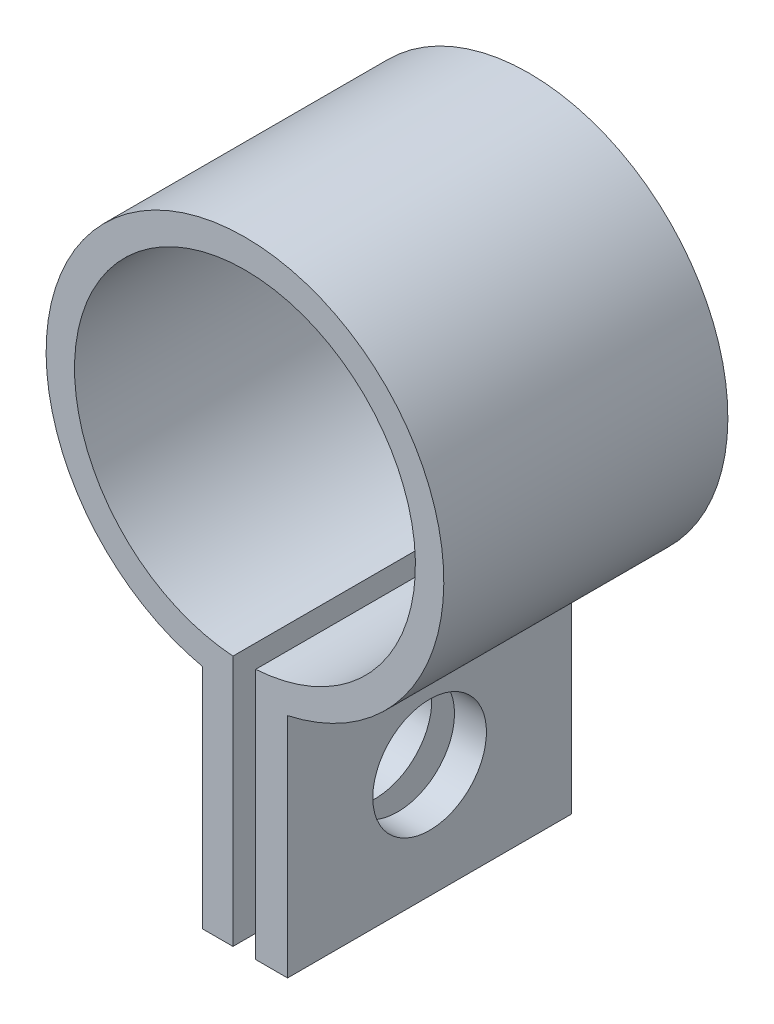
ISO-10303-21;
HEADER;
FILE_DESCRIPTION(('STEP AP214'),'2;1');
FILE_NAME('part.step','',(''),(''),'','','');
FILE_SCHEMA(('AUTOMOTIVE_DESIGN { 1 0 10303 214 1 1 1 1 }'));
ENDSEC;
DATA;
#1=APPLICATION_CONTEXT('core data for automotive mechanical design processes');
#2=APPLICATION_PROTOCOL_DEFINITION('international standard','automotive_design',2000,#1);
#3=PRODUCT_CONTEXT('',#1,'mechanical');
#4=PRODUCT('Part','Part','',(#3));
#5=PRODUCT_RELATED_PRODUCT_CATEGORY('part','',(#4));
#6=PRODUCT_DEFINITION_FORMATION('','',#4);
#7=PRODUCT_DEFINITION_CONTEXT('part definition',#1,'design');
#8=PRODUCT_DEFINITION('design','',#6,#7);
#9=PRODUCT_DEFINITION_SHAPE('','',#8);
#10=(LENGTH_UNIT() NAMED_UNIT(*) SI_UNIT(.MILLI.,.METRE.));
#11=(NAMED_UNIT(*) PLANE_ANGLE_UNIT() SI_UNIT($,.RADIAN.));
#12=(NAMED_UNIT(*) SI_UNIT($,.STERADIAN.) SOLID_ANGLE_UNIT());
#13=UNCERTAINTY_MEASURE_WITH_UNIT(LENGTH_MEASURE(1.E-05),#10,'distance_accuracy_value','');
#14=(GEOMETRIC_REPRESENTATION_CONTEXT(3) GLOBAL_UNCERTAINTY_ASSIGNED_CONTEXT((#13)) GLOBAL_UNIT_ASSIGNED_CONTEXT((#10,
#11,#12)) REPRESENTATION_CONTEXT('',''));
#15=CARTESIAN_POINT('',(0.,0.,0.));
#16=DIRECTION('',(0.,0.,1.));
#17=DIRECTION('',(1.,0.,0.));
#18=AXIS2_PLACEMENT_3D('',#15,#16,#17);
#19=CARTESIAN_POINT('',(1.5,-14.8373971655887,5.));
#20=DIRECTION('',(0.,1.,0.));
#21=DIRECTION('',(0.,0.,1.));
#22=AXIS2_PLACEMENT_3D('',#19,#20,#21);
#23=PLANE('',#22);
#24=DIRECTION('',(1.,0.,0.));
#25=VECTOR('',#24,1.);
#26=CARTESIAN_POINT('',(1.5,-14.8373971655887,-5.));
#27=LINE('',#26,#25);
#28=CARTESIAN_POINT('',(-1.5,-14.8373971655887,-5.));
#29=VERTEX_POINT('',#28);
#30=CARTESIAN_POINT('',(-0.423202653319375,-14.8373971655887,-5.));
#31=VERTEX_POINT('',#30);
#32=EDGE_CURVE('E140',#29,#31,#27,.T.);
#33=ORIENTED_EDGE('',*,*,#32,.T.);
#34=DIRECTION('',(0.,0.,1.));
#35=VECTOR('',#34,1.);
#36=CARTESIAN_POINT('',(-0.423202653319375,-14.8373971655887,5.));
#37=LINE('',#36,#35);
#38=CARTESIAN_POINT('',(-0.423202653319375,-14.8373971655887,5.));
#39=VERTEX_POINT('',#38);
#40=EDGE_CURVE('E130',#31,#39,#37,.T.);
#41=ORIENTED_EDGE('',*,*,#40,.T.);
#42=DIRECTION('',(1.,0.,0.));
#43=VECTOR('',#42,1.);
#44=CARTESIAN_POINT('',(1.5,-14.8373971655887,5.));
#45=LINE('',#44,#43);
#46=CARTESIAN_POINT('',(-1.5,-14.8373971655887,5.));
#47=VERTEX_POINT('',#46);
#48=EDGE_CURVE('E116',#47,#39,#45,.T.);
#49=ORIENTED_EDGE('',*,*,#48,.F.);
#50=DIRECTION('',(0.,0.,-1.));
#51=VECTOR('',#50,1.);
#52=CARTESIAN_POINT('',(-1.5,-14.8373971655887,5.));
#53=LINE('',#52,#51);
#54=EDGE_CURVE('E162',#47,#29,#53,.T.);
#55=ORIENTED_EDGE('',*,*,#54,.T.);
#56=EDGE_LOOP('',(#33,#41,#49,#55));
#57=FACE_BOUND('',#56,.T.);
#58=ADVANCED_FACE('F39',(#57),#23,.F.);
#59=CARTESIAN_POINT('',(0.,0.,5.));
#60=DIRECTION('',(0.,0.,1.));
#61=DIRECTION('',(1.,0.,0.));
#62=AXIS2_PLACEMENT_3D('',#59,#60,#61);
#63=PLANE('',#62);
#64=DIRECTION('',(0.,-1.,0.));
#65=VECTOR('',#64,1.);
#66=CARTESIAN_POINT('',(-0.423202653319375,0.,5.));
#67=LINE('',#66,#65);
#68=CARTESIAN_POINT('',(-0.423202653319375,-5.98505635012933,5.));
#69=VERTEX_POINT('',#68);
#70=EDGE_CURVE('E104',#69,#39,#67,.T.);
#71=ORIENTED_EDGE('',*,*,#70,.F.);
#72=CARTESIAN_POINT('',(0.,0.,5.));
#73=DIRECTION('',(0.,0.,1.));
#74=DIRECTION('',(1.,0.,0.));
#75=AXIS2_PLACEMENT_3D('',#72,#73,#74);
#76=CIRCLE('',#75,6.);
#77=CARTESIAN_POINT('',(0.376647387592764,-5.98816639259628,5.));
#78=VERTEX_POINT('',#77);
#79=EDGE_CURVE('E114',#78,#69,#76,.T.);
#80=ORIENTED_EDGE('',*,*,#79,.F.);
#81=DIRECTION('',(0.,1.,0.));
#82=VECTOR('',#81,1.);
#83=CARTESIAN_POINT('',(0.376647387592764,0.,5.));
#84=LINE('',#83,#82);
#85=CARTESIAN_POINT('',(0.376647387592764,-14.8373971655887,5.));
#86=VERTEX_POINT('',#85);
#87=EDGE_CURVE('E63',#86,#78,#84,.T.);
#88=ORIENTED_EDGE('',*,*,#87,.F.);
#89=CARTESIAN_POINT('',(1.5,-14.8373971655887,5.));
#90=VERTEX_POINT('',#89);
#91=EDGE_CURVE('E146',#86,#90,#45,.T.);
#92=ORIENTED_EDGE('',*,*,#91,.T.);
#93=DIRECTION('',(0.,1.,0.));
#94=VECTOR('',#93,1.);
#95=CARTESIAN_POINT('',(1.5,-14.8373971655887,5.));
#96=LINE('',#95,#94);
#97=CARTESIAN_POINT('',(1.5,-6.83739716558867,5.));
#98=VERTEX_POINT('',#97);
#99=EDGE_CURVE('E135',#90,#98,#96,.T.);
#100=ORIENTED_EDGE('',*,*,#99,.T.);
#101=CARTESIAN_POINT('',(0.,0.,5.));
#102=DIRECTION('',(0.,0.,1.));
#103=DIRECTION('',(1.,0.,0.));
#104=AXIS2_PLACEMENT_3D('',#101,#102,#103);
#105=CIRCLE('',#104,7.);
#106=CARTESIAN_POINT('',(-1.5,-6.83739716558867,5.));
#107=VERTEX_POINT('',#106);
#108=EDGE_CURVE('E139',#98,#107,#105,.T.);
#109=ORIENTED_EDGE('',*,*,#108,.T.);
#110=DIRECTION('',(0.,-1.,0.));
#111=VECTOR('',#110,1.);
#112=CARTESIAN_POINT('',(-1.5,-14.8373971655887,5.));
#113=LINE('',#112,#111);
#114=EDGE_CURVE('E143',#107,#47,#113,.T.);
#115=ORIENTED_EDGE('',*,*,#114,.T.);
#116=ORIENTED_EDGE('',*,*,#48,.T.);
#117=EDGE_LOOP('',(#71,#80,#88,#92,#100,#109,#115,#116));
#118=FACE_BOUND('',#117,.T.);
#119=ADVANCED_FACE('F113',(#118),#63,.T.);
#120=CARTESIAN_POINT('',(0.,0.,-5.));
#121=DIRECTION('',(0.,0.,1.));
#122=DIRECTION('',(1.,0.,0.));
#123=AXIS2_PLACEMENT_3D('',#120,#121,#122);
#124=PLANE('',#123);
#125=CARTESIAN_POINT('',(0.,0.,-5.));
#126=DIRECTION('',(0.,0.,1.));
#127=DIRECTION('',(1.,0.,0.));
#128=AXIS2_PLACEMENT_3D('',#125,#126,#127);
#129=CIRCLE('',#128,6.);
#130=CARTESIAN_POINT('',(0.376647387592764,-5.98816639259628,-5.));
#131=VERTEX_POINT('',#130);
#132=CARTESIAN_POINT('',(-0.423202653319375,-5.98505635012933,-5.));
#133=VERTEX_POINT('',#132);
#134=EDGE_CURVE('E123',#131,#133,#129,.T.);
#135=ORIENTED_EDGE('',*,*,#134,.T.);
#136=DIRECTION('',(0.,-1.,0.));
#137=VECTOR('',#136,1.);
#138=CARTESIAN_POINT('',(-0.423202653319375,0.,-5.));
#139=LINE('',#138,#137);
#140=EDGE_CURVE('E55',#133,#31,#139,.T.);
#141=ORIENTED_EDGE('',*,*,#140,.T.);
#142=ORIENTED_EDGE('',*,*,#32,.F.);
#143=DIRECTION('',(0.,-1.,0.));
#144=VECTOR('',#143,1.);
#145=CARTESIAN_POINT('',(-1.5,-14.8373971655887,-5.));
#146=LINE('',#145,#144);
#147=CARTESIAN_POINT('',(-1.5,-6.83739716558867,-5.));
#148=VERTEX_POINT('',#147);
#149=EDGE_CURVE('E152',#148,#29,#146,.T.);
#150=ORIENTED_EDGE('',*,*,#149,.F.);
#151=CARTESIAN_POINT('',(0.,0.,-5.));
#152=DIRECTION('',(0.,0.,1.));
#153=DIRECTION('',(1.,0.,0.));
#154=AXIS2_PLACEMENT_3D('',#151,#152,#153);
#155=CIRCLE('',#154,7.);
#156=CARTESIAN_POINT('',(1.5,-6.83739716558867,-5.));
#157=VERTEX_POINT('',#156);
#158=EDGE_CURVE('E128',#157,#148,#155,.T.);
#159=ORIENTED_EDGE('',*,*,#158,.F.);
#160=DIRECTION('',(0.,1.,0.));
#161=VECTOR('',#160,1.);
#162=CARTESIAN_POINT('',(1.5,-14.8373971655887,-5.));
#163=LINE('',#162,#161);
#164=CARTESIAN_POINT('',(1.5,-14.8373971655887,-5.));
#165=VERTEX_POINT('',#164);
#166=EDGE_CURVE('E122',#165,#157,#163,.T.);
#167=ORIENTED_EDGE('',*,*,#166,.F.);
#168=CARTESIAN_POINT('',(0.376647387592764,-14.8373971655887,-5.));
#169=VERTEX_POINT('',#168);
#170=EDGE_CURVE('E155',#169,#165,#27,.T.);
#171=ORIENTED_EDGE('',*,*,#170,.F.);
#172=DIRECTION('',(0.,1.,0.));
#173=VECTOR('',#172,1.);
#174=CARTESIAN_POINT('',(0.376647387592764,0.,-5.));
#175=LINE('',#174,#173);
#176=EDGE_CURVE('E177',#169,#131,#175,.T.);
#177=ORIENTED_EDGE('',*,*,#176,.T.);
#178=EDGE_LOOP('',(#135,#141,#142,#150,#159,#167,#171,#177));
#179=FACE_BOUND('',#178,.T.);
#180=ADVANCED_FACE('F181',(#179),#124,.F.);
#181=CARTESIAN_POINT('',(1.5,-14.8373971655887,5.));
#182=DIRECTION('',(-1.,0.,0.));
#183=DIRECTION('',(0.,0.,1.));
#184=AXIS2_PLACEMENT_3D('',#181,#182,#183);
#185=PLANE('',#184);
#186=CARTESIAN_POINT('',(1.5,-10.8373971655887,0.));
#187=DIRECTION('',(-1.,0.,0.));
#188=DIRECTION('',(0.,0.,1.));
#189=AXIS2_PLACEMENT_3D('',#186,#187,#188);
#190=CIRCLE('',#189,1.99999999999999);
#191=CARTESIAN_POINT('',(1.5,-10.8373971655887,1.99999999999999));
#192=VERTEX_POINT('',#191);
#193=EDGE_CURVE('E118',#192,#192,#190,.T.);
#194=ORIENTED_EDGE('',*,*,#193,.T.);
#195=EDGE_LOOP('',(#194));
#196=FACE_BOUND('',#195,.T.);
#197=ORIENTED_EDGE('',*,*,#166,.T.);
#198=DIRECTION('',(0.,0.,-1.));
#199=VECTOR('',#198,1.);
#200=CARTESIAN_POINT('',(1.5,-6.83739716558867,5.));
#201=LINE('',#200,#199);
#202=EDGE_CURVE('E170',#98,#157,#201,.T.);
#203=ORIENTED_EDGE('',*,*,#202,.F.);
#204=ORIENTED_EDGE('',*,*,#99,.F.);
#205=DIRECTION('',(0.,0.,-1.));
#206=VECTOR('',#205,1.);
#207=CARTESIAN_POINT('',(1.5,-14.8373971655887,5.));
#208=LINE('',#207,#206);
#209=EDGE_CURVE('E148',#90,#165,#208,.T.);
#210=ORIENTED_EDGE('',*,*,#209,.T.);
#211=EDGE_LOOP('',(#197,#203,#204,#210));
#212=FACE_BOUND('',#211,.T.);
#213=ADVANCED_FACE('F41',(#196,#212),#185,.F.);
#214=CARTESIAN_POINT('',(0.,0.,5.));
#215=DIRECTION('',(0.,0.,-1.));
#216=DIRECTION('',(-1.,0.,0.));
#217=AXIS2_PLACEMENT_3D('',#214,#215,#216);
#218=CYLINDRICAL_SURFACE('',#217,7.);
#219=ORIENTED_EDGE('',*,*,#158,.T.);
#220=DIRECTION('',(0.,0.,-1.));
#221=VECTOR('',#220,1.);
#222=CARTESIAN_POINT('',(-1.5,-6.83739716558867,5.));
#223=LINE('',#222,#221);
#224=EDGE_CURVE('E166',#107,#148,#223,.T.);
#225=ORIENTED_EDGE('',*,*,#224,.F.);
#226=ORIENTED_EDGE('',*,*,#108,.F.);
#227=ORIENTED_EDGE('',*,*,#202,.T.);
#228=EDGE_LOOP('',(#219,#225,#226,#227));
#229=FACE_BOUND('',#228,.T.);
#230=ADVANCED_FACE('F213',(#229),#218,.T.);
#231=CARTESIAN_POINT('',(-1.5,-14.8373971655887,5.));
#232=DIRECTION('',(1.,0.,0.));
#233=DIRECTION('',(0.,0.,-1.));
#234=AXIS2_PLACEMENT_3D('',#231,#232,#233);
#235=PLANE('',#234);
#236=CARTESIAN_POINT('',(-1.5,-10.8373971655887,0.));
#237=DIRECTION('',(-1.,0.,0.));
#238=DIRECTION('',(0.,0.,1.));
#239=AXIS2_PLACEMENT_3D('',#236,#237,#238);
#240=CIRCLE('',#239,2.);
#241=CARTESIAN_POINT('',(-1.5,-10.8373971655887,2.));
#242=VERTEX_POINT('',#241);
#243=EDGE_CURVE('E201',#242,#242,#240,.T.);
#244=ORIENTED_EDGE('',*,*,#243,.F.);
#245=EDGE_LOOP('',(#244));
#246=FACE_BOUND('',#245,.T.);
#247=ORIENTED_EDGE('',*,*,#149,.T.);
#248=ORIENTED_EDGE('',*,*,#54,.F.);
#249=ORIENTED_EDGE('',*,*,#114,.F.);
#250=ORIENTED_EDGE('',*,*,#224,.T.);
#251=EDGE_LOOP('',(#247,#248,#249,#250));
#252=FACE_BOUND('',#251,.T.);
#253=ADVANCED_FACE('F209',(#246,#252),#235,.F.);
#254=ORIENTED_EDGE('',*,*,#91,.F.);
#255=DIRECTION('',(0.,0.,-1.));
#256=VECTOR('',#255,1.);
#257=CARTESIAN_POINT('',(0.376647387592764,-14.8373971655887,5.));
#258=LINE('',#257,#256);
#259=EDGE_CURVE('E184',#86,#169,#258,.T.);
#260=ORIENTED_EDGE('',*,*,#259,.T.);
#261=ORIENTED_EDGE('',*,*,#170,.T.);
#262=ORIENTED_EDGE('',*,*,#209,.F.);
#263=EDGE_LOOP('',(#254,#260,#261,#262));
#264=FACE_BOUND('',#263,.T.);
#265=ADVANCED_FACE('F212',(#264),#23,.F.);
#266=CARTESIAN_POINT('',(0.,0.,5.));
#267=DIRECTION('',(0.,0.,-1.));
#268=DIRECTION('',(-1.,0.,0.));
#269=AXIS2_PLACEMENT_3D('',#266,#267,#268);
#270=CYLINDRICAL_SURFACE('',#269,6.);
#271=DIRECTION('',(0.,0.,-1.));
#272=VECTOR('',#271,1.);
#273=CARTESIAN_POINT('',(-0.423202653319375,-5.98505635012933,5.));
#274=LINE('',#273,#272);
#275=EDGE_CURVE('E11',#133,#69,#274,.F.);
#276=ORIENTED_EDGE('',*,*,#275,.F.);
#277=ORIENTED_EDGE('',*,*,#134,.F.);
#278=DIRECTION('',(0.,0.,-1.));
#279=VECTOR('',#278,1.);
#280=CARTESIAN_POINT('',(0.376647387592764,-5.98816639259628,5.));
#281=LINE('',#280,#279);
#282=EDGE_CURVE('E49',#78,#131,#281,.T.);
#283=ORIENTED_EDGE('',*,*,#282,.F.);
#284=ORIENTED_EDGE('',*,*,#79,.T.);
#285=EDGE_LOOP('',(#276,#277,#283,#284));
#286=FACE_BOUND('',#285,.T.);
#287=ADVANCED_FACE('F120',(#286),#270,.F.);
#288=CARTESIAN_POINT('',(0.376647387592764,0.,-5.));
#289=DIRECTION('',(1.,0.,0.));
#290=DIRECTION('',(0.,0.,-1.));
#291=AXIS2_PLACEMENT_3D('',#288,#289,#290);
#292=PLANE('',#291);
#293=CARTESIAN_POINT('',(0.376647387592764,-10.8373971655887,0.));
#294=DIRECTION('',(1.,0.,0.));
#295=DIRECTION('',(0.,0.,-1.));
#296=AXIS2_PLACEMENT_3D('',#293,#294,#295);
#297=CIRCLE('',#296,1.99999999999999);
#298=CARTESIAN_POINT('',(0.376647387592764,-10.8373971655887,-1.99999999999999));
#299=VERTEX_POINT('',#298);
#300=EDGE_CURVE('E195',#299,#299,#297,.T.);
#301=ORIENTED_EDGE('',*,*,#300,.T.);
#302=EDGE_LOOP('',(#301));
#303=FACE_BOUND('',#302,.T.);
#304=ORIENTED_EDGE('',*,*,#87,.T.);
#305=ORIENTED_EDGE('',*,*,#282,.T.);
#306=ORIENTED_EDGE('',*,*,#176,.F.);
#307=ORIENTED_EDGE('',*,*,#259,.F.);
#308=EDGE_LOOP('',(#304,#305,#306,#307));
#309=FACE_BOUND('',#308,.T.);
#310=ADVANCED_FACE('F176',(#303,#309),#292,.F.);
#311=CARTESIAN_POINT('',(-0.423202653319375,0.,-5.));
#312=DIRECTION('',(-1.,0.,0.));
#313=DIRECTION('',(0.,0.,1.));
#314=AXIS2_PLACEMENT_3D('',#311,#312,#313);
#315=PLANE('',#314);
#316=CARTESIAN_POINT('',(-0.423202653319375,-10.8373971655887,0.));
#317=DIRECTION('',(-1.,0.,0.));
#318=DIRECTION('',(0.,0.,1.));
#319=AXIS2_PLACEMENT_3D('',#316,#317,#318);
#320=CIRCLE('',#319,1.99999999999999);
#321=CARTESIAN_POINT('',(-0.423202653319375,-10.8373971655887,1.99999999999999));
#322=VERTEX_POINT('',#321);
#323=EDGE_CURVE('E43',#322,#322,#320,.T.);
#324=ORIENTED_EDGE('',*,*,#323,.T.);
#325=EDGE_LOOP('',(#324));
#326=FACE_BOUND('',#325,.T.);
#327=ORIENTED_EDGE('',*,*,#140,.F.);
#328=ORIENTED_EDGE('',*,*,#275,.T.);
#329=ORIENTED_EDGE('',*,*,#70,.T.);
#330=ORIENTED_EDGE('',*,*,#40,.F.);
#331=EDGE_LOOP('',(#327,#328,#329,#330));
#332=FACE_BOUND('',#331,.T.);
#333=ADVANCED_FACE('F103',(#326,#332),#315,.F.);
#334=CARTESIAN_POINT('',(-1.5,-10.8373971655887,0.));
#335=DIRECTION('',(-1.,0.,0.));
#336=DIRECTION('',(0.,0.,1.));
#337=AXIS2_PLACEMENT_3D('',#334,#335,#336);
#338=CYLINDRICAL_SURFACE('',#337,1.99999999999999);
#339=ORIENTED_EDGE('',*,*,#243,.T.);
#340=EDGE_LOOP('',(#339));
#341=FACE_BOUND('',#340,.T.);
#342=ORIENTED_EDGE('',*,*,#323,.F.);
#343=EDGE_LOOP('',(#342));
#344=FACE_BOUND('',#343,.T.);
#345=ADVANCED_FACE('F206',(#341,#344),#338,.F.);
#346=ORIENTED_EDGE('',*,*,#300,.F.);
#347=EDGE_LOOP('',(#346));
#348=FACE_BOUND('',#347,.T.);
#349=ORIENTED_EDGE('',*,*,#193,.F.);
#350=EDGE_LOOP('',(#349));
#351=FACE_BOUND('',#350,.T.);
#352=ADVANCED_FACE('F253',(#348,#351),#338,.F.);
#353=CLOSED_SHELL('',(#58,#119,#180,#213,#230,#253,#265,#287,#310,#333,#345,#352));
#354=MANIFOLD_SOLID_BREP('B2',#353);
#355=ADVANCED_BREP_SHAPE_REPRESENTATION('',(#18,#354),#14);
#356=SHAPE_DEFINITION_REPRESENTATION(#9,#355);
ENDSEC;
END-ISO-10303-21;
